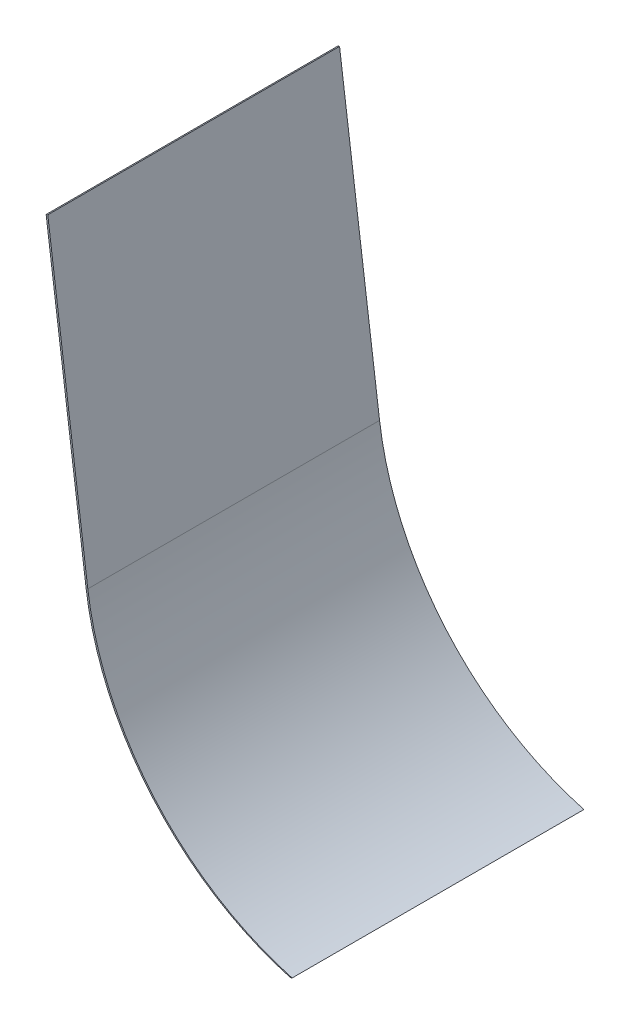
ISO-10303-21;
HEADER;
FILE_DESCRIPTION(('STEP AP214'),'2;1');
FILE_NAME('part.step','',(''),(''),'','','');
FILE_SCHEMA(('AUTOMOTIVE_DESIGN { 1 0 10303 214 1 1 1 1 }'));
ENDSEC;
DATA;
#1=APPLICATION_CONTEXT('core data for automotive mechanical design processes');
#2=APPLICATION_PROTOCOL_DEFINITION('international standard','automotive_design',2000,#1);
#3=PRODUCT_CONTEXT('',#1,'mechanical');
#4=PRODUCT('Part','Part','',(#3));
#5=PRODUCT_RELATED_PRODUCT_CATEGORY('part','',(#4));
#6=PRODUCT_DEFINITION_FORMATION('','',#4);
#7=PRODUCT_DEFINITION_CONTEXT('part definition',#1,'design');
#8=PRODUCT_DEFINITION('design','',#6,#7);
#9=PRODUCT_DEFINITION_SHAPE('','',#8);
#10=(LENGTH_UNIT() NAMED_UNIT(*) SI_UNIT(.MILLI.,.METRE.));
#11=(NAMED_UNIT(*) PLANE_ANGLE_UNIT() SI_UNIT($,.RADIAN.));
#12=(NAMED_UNIT(*) SI_UNIT($,.STERADIAN.) SOLID_ANGLE_UNIT());
#13=UNCERTAINTY_MEASURE_WITH_UNIT(LENGTH_MEASURE(1.E-05),#10,'distance_accuracy_value','');
#14=(GEOMETRIC_REPRESENTATION_CONTEXT(3) GLOBAL_UNCERTAINTY_ASSIGNED_CONTEXT((#13)) GLOBAL_UNIT_ASSIGNED_CONTEXT((#10,
#11,#12)) REPRESENTATION_CONTEXT('',''));
#15=CARTESIAN_POINT('',(0.,0.,0.));
#16=DIRECTION('',(0.,0.,1.));
#17=DIRECTION('',(1.,0.,0.));
#18=AXIS2_PLACEMENT_3D('',#15,#16,#17);
#19=CARTESIAN_POINT('',(-22.2558385353697,1100.13470649072,536.448));
#20=DIRECTION('',(0.298124189718695,-0.954527091027055,0.));
#21=DIRECTION('',(0.954527091027055,0.298124189718695,0.));
#22=AXIS2_PLACEMENT_3D('',#19,#20,#21);
#23=PLANE('',#22);
#24=DIRECTION('',(-0.954527091027055,-0.298124189718695,0.));
#25=VECTOR('',#24,1.);
#26=CARTESIAN_POINT('',(-22.2558385353697,1100.13470649072,0.));
#27=LINE('',#26,#25);
#28=CARTESIAN_POINT('',(-19.2252150213588,1101.08125079308,0.));
#29=VERTEX_POINT('',#28);
#30=CARTESIAN_POINT('',(-22.2558385353697,1100.13470649072,0.));
#31=VERTEX_POINT('',#30);
#32=EDGE_CURVE('E138',#29,#31,#27,.T.);
#33=ORIENTED_EDGE('',*,*,#32,.T.);
#34=DIRECTION('',(0.,0.,-1.));
#35=VECTOR('',#34,1.);
#36=CARTESIAN_POINT('',(-22.2558385353697,1100.13470649072,536.448));
#37=LINE('',#36,#35);
#38=CARTESIAN_POINT('',(-22.2558385353697,1100.13470649072,536.448));
#39=VERTEX_POINT('',#38);
#40=EDGE_CURVE('E11',#39,#31,#37,.T.);
#41=ORIENTED_EDGE('',*,*,#40,.F.);
#42=DIRECTION('',(-0.954527091027055,-0.298124189718695,0.));
#43=VECTOR('',#42,1.);
#44=CARTESIAN_POINT('',(-22.2558385353697,1100.13470649072,536.448));
#45=LINE('',#44,#43);
#46=CARTESIAN_POINT('',(-19.2252150213588,1101.08125079308,536.448));
#47=VERTEX_POINT('',#46);
#48=EDGE_CURVE('E154',#47,#39,#45,.T.);
#49=ORIENTED_EDGE('',*,*,#48,.F.);
#50=DIRECTION('',(0.,0.,-1.));
#51=VECTOR('',#50,1.);
#52=CARTESIAN_POINT('',(-19.2252150213588,1101.08125079308,536.448));
#53=LINE('',#52,#51);
#54=EDGE_CURVE('E134',#47,#29,#53,.T.);
#55=ORIENTED_EDGE('',*,*,#54,.T.);
#56=EDGE_LOOP('',(#33,#41,#49,#55));
#57=FACE_BOUND('',#56,.T.);
#58=ADVANCED_FACE('F43',(#57),#23,.F.);
#59=CARTESIAN_POINT('',(-22.2558385353697,1100.13470649072,536.448));
#60=DIRECTION('',(0.991444861373811,0.130526192220048,0.));
#61=DIRECTION('',(-0.130526192220048,0.991444861373811,0.));
#62=AXIS2_PLACEMENT_3D('',#59,#60,#61);
#63=PLANE('',#62);
#64=DIRECTION('',(0.130526192220048,-0.991444861373811,0.));
#65=VECTOR('',#64,1.);
#66=CARTESIAN_POINT('',(-22.2558385353697,1100.13470649072,0.));
#67=LINE('',#66,#65);
#68=CARTESIAN_POINT('',(51.3115771164653,541.334706490722,0.));
#69=VERTEX_POINT('',#68);
#70=EDGE_CURVE('E142',#31,#69,#67,.T.);
#71=ORIENTED_EDGE('',*,*,#70,.T.);
#72=DIRECTION('',(0.,0.,-1.));
#73=VECTOR('',#72,1.);
#74=CARTESIAN_POINT('',(51.3115771164653,541.334706490722,536.448));
#75=LINE('',#74,#73);
#76=CARTESIAN_POINT('',(51.3115771164653,541.334706490722,536.448));
#77=VERTEX_POINT('',#76);
#78=EDGE_CURVE('E52',#77,#69,#75,.T.);
#79=ORIENTED_EDGE('',*,*,#78,.F.);
#80=DIRECTION('',(0.130526192220048,-0.991444861373811,0.));
#81=VECTOR('',#80,1.);
#82=CARTESIAN_POINT('',(-22.2558385353697,1100.13470649072,536.448));
#83=LINE('',#82,#81);
#84=EDGE_CURVE('E100',#39,#77,#83,.T.);
#85=ORIENTED_EDGE('',*,*,#84,.F.);
#86=ORIENTED_EDGE('',*,*,#40,.T.);
#87=EDGE_LOOP('',(#71,#79,#85,#86));
#88=FACE_BOUND('',#87,.T.);
#89=ADVANCED_FACE('F182',(#88),#63,.F.);
#90=CARTESIAN_POINT('',(565.061154076165,608.971121431932,536.448));
#91=DIRECTION('',(0.,0.,-1.));
#92=DIRECTION('',(-1.,0.,0.));
#93=AXIS2_PLACEMENT_3D('',#90,#91,#92);
#94=CYLINDRICAL_SURFACE('',#93,518.182701807354);
#95=CARTESIAN_POINT('',(565.061154076165,608.971121431932,0.));
#96=DIRECTION('',(0.,0.,1.));
#97=DIRECTION('',(1.,0.,0.));
#98=AXIS2_PLACEMENT_3D('',#95,#96,#97);
#99=CIRCLE('',#98,518.182701807354);
#100=CARTESIAN_POINT('',(426.94316146463,109.534706490722,0.));
#101=VERTEX_POINT('',#100);
#102=EDGE_CURVE('E145',#69,#101,#99,.T.);
#103=ORIENTED_EDGE('',*,*,#102,.T.);
#104=DIRECTION('',(0.,0.,-1.));
#105=VECTOR('',#104,1.);
#106=CARTESIAN_POINT('',(426.94316146463,109.534706490722,536.448));
#107=LINE('',#106,#105);
#108=CARTESIAN_POINT('',(426.94316146463,109.534706490722,536.448));
#109=VERTEX_POINT('',#108);
#110=EDGE_CURVE('E127',#109,#101,#107,.T.);
#111=ORIENTED_EDGE('',*,*,#110,.F.);
#112=CARTESIAN_POINT('',(565.061154076165,608.971121431932,536.448));
#113=DIRECTION('',(0.,0.,1.));
#114=DIRECTION('',(1.,0.,0.));
#115=AXIS2_PLACEMENT_3D('',#112,#113,#114);
#116=CIRCLE('',#115,518.182701807354);
#117=EDGE_CURVE('E116',#77,#109,#116,.T.);
#118=ORIENTED_EDGE('',*,*,#117,.F.);
#119=ORIENTED_EDGE('',*,*,#78,.T.);
#120=EDGE_LOOP('',(#103,#111,#118,#119));
#121=FACE_BOUND('',#120,.T.);
#122=ADVANCED_FACE('F164',(#121),#94,.T.);
#123=CARTESIAN_POINT('',(426.94316146463,109.534706490722,536.448));
#124=DIRECTION('',(-0.298124189718695,0.954527091027055,0.));
#125=DIRECTION('',(-0.954527091027055,-0.298124189718695,0.));
#126=AXIS2_PLACEMENT_3D('',#123,#124,#125);
#127=PLANE('',#126);
#128=DIRECTION('',(0.954527091027055,0.298124189718695,0.));
#129=VECTOR('',#128,1.);
#130=CARTESIAN_POINT('',(426.94316146463,109.534706490722,0.));
#131=LINE('',#130,#129);
#132=CARTESIAN_POINT('',(429.973784978641,110.481250793079,0.));
#133=VERTEX_POINT('',#132);
#134=EDGE_CURVE('E125',#101,#133,#131,.T.);
#135=ORIENTED_EDGE('',*,*,#134,.T.);
#136=DIRECTION('',(0.,0.,-1.));
#137=VECTOR('',#136,1.);
#138=CARTESIAN_POINT('',(429.973784978641,110.481250793079,536.448));
#139=LINE('',#138,#137);
#140=CARTESIAN_POINT('',(429.973784978641,110.481250793079,536.448));
#141=VERTEX_POINT('',#140);
#142=EDGE_CURVE('E122',#141,#133,#139,.T.);
#143=ORIENTED_EDGE('',*,*,#142,.F.);
#144=DIRECTION('',(0.954527091027055,0.298124189718695,0.));
#145=VECTOR('',#144,1.);
#146=CARTESIAN_POINT('',(426.94316146463,109.534706490722,536.448));
#147=LINE('',#146,#145);
#148=EDGE_CURVE('E110',#109,#141,#147,.T.);
#149=ORIENTED_EDGE('',*,*,#148,.F.);
#150=ORIENTED_EDGE('',*,*,#110,.T.);
#151=EDGE_LOOP('',(#135,#143,#149,#150));
#152=FACE_BOUND('',#151,.T.);
#153=ADVANCED_FACE('F123',(#152),#127,.F.);
#154=CARTESIAN_POINT('',(568.091777590175,609.91766573429,536.448));
#155=DIRECTION('',(0.,0.,-1.));
#156=DIRECTION('',(-1.,0.,0.));
#157=AXIS2_PLACEMENT_3D('',#154,#155,#156);
#158=CYLINDRICAL_SURFACE('',#157,518.182701807354);
#159=CARTESIAN_POINT('',(568.091777590175,609.91766573429,0.));
#160=DIRECTION('',(0.,0.,-1.));
#161=DIRECTION('',(1.,0.,0.));
#162=AXIS2_PLACEMENT_3D('',#159,#160,#161);
#163=CIRCLE('',#162,518.182701807354);
#164=CARTESIAN_POINT('',(54.342200630476,542.281250793079,0.));
#165=VERTEX_POINT('',#164);
#166=EDGE_CURVE('E86',#133,#165,#163,.T.);
#167=ORIENTED_EDGE('',*,*,#166,.T.);
#168=DIRECTION('',(0.,0.,-1.));
#169=VECTOR('',#168,1.);
#170=CARTESIAN_POINT('',(54.342200630476,542.281250793079,536.448));
#171=LINE('',#170,#169);
#172=CARTESIAN_POINT('',(54.342200630476,542.281250793079,536.448));
#173=VERTEX_POINT('',#172);
#174=EDGE_CURVE('E128',#173,#165,#171,.T.);
#175=ORIENTED_EDGE('',*,*,#174,.F.);
#176=CARTESIAN_POINT('',(568.091777590175,609.91766573429,536.448));
#177=DIRECTION('',(0.,0.,-1.));
#178=DIRECTION('',(1.,0.,0.));
#179=AXIS2_PLACEMENT_3D('',#176,#177,#178);
#180=CIRCLE('',#179,518.182701807354);
#181=EDGE_CURVE('E114',#141,#173,#180,.T.);
#182=ORIENTED_EDGE('',*,*,#181,.F.);
#183=ORIENTED_EDGE('',*,*,#142,.T.);
#184=EDGE_LOOP('',(#167,#175,#182,#183));
#185=FACE_BOUND('',#184,.T.);
#186=ADVANCED_FACE('F130',(#185),#158,.F.);
#187=CARTESIAN_POINT('',(-19.2252150213588,1101.08125079308,536.448));
#188=DIRECTION('',(-0.991444861373811,-0.130526192220048,0.));
#189=DIRECTION('',(0.130526192220048,-0.991444861373811,0.));
#190=AXIS2_PLACEMENT_3D('',#187,#188,#189);
#191=PLANE('',#190);
#192=DIRECTION('',(-0.130526192220048,0.991444861373811,0.));
#193=VECTOR('',#192,1.);
#194=CARTESIAN_POINT('',(-19.2252150213588,1101.08125079308,0.));
#195=LINE('',#194,#193);
#196=EDGE_CURVE('E92',#165,#29,#195,.T.);
#197=ORIENTED_EDGE('',*,*,#196,.T.);
#198=ORIENTED_EDGE('',*,*,#54,.F.);
#199=DIRECTION('',(-0.130526192220048,0.991444861373811,0.));
#200=VECTOR('',#199,1.);
#201=CARTESIAN_POINT('',(-19.2252150213588,1101.08125079308,536.448));
#202=LINE('',#201,#200);
#203=EDGE_CURVE('E60',#173,#47,#202,.T.);
#204=ORIENTED_EDGE('',*,*,#203,.F.);
#205=ORIENTED_EDGE('',*,*,#174,.T.);
#206=EDGE_LOOP('',(#197,#198,#204,#205));
#207=FACE_BOUND('',#206,.T.);
#208=ADVANCED_FACE('F171',(#207),#191,.F.);
#209=CARTESIAN_POINT('',(568.091777590175,609.91766573429,536.448));
#210=DIRECTION('',(0.,0.,1.));
#211=DIRECTION('',(1.,0.,0.));
#212=AXIS2_PLACEMENT_3D('',#209,#210,#211);
#213=PLANE('',#212);
#214=ORIENTED_EDGE('',*,*,#48,.T.);
#215=ORIENTED_EDGE('',*,*,#84,.T.);
#216=ORIENTED_EDGE('',*,*,#117,.T.);
#217=ORIENTED_EDGE('',*,*,#148,.T.);
#218=ORIENTED_EDGE('',*,*,#181,.T.);
#219=ORIENTED_EDGE('',*,*,#203,.T.);
#220=EDGE_LOOP('',(#214,#215,#216,#217,#218,#219));
#221=FACE_BOUND('',#220,.T.);
#222=ADVANCED_FACE('F112',(#221),#213,.T.);
#223=CARTESIAN_POINT('',(568.091777590175,609.91766573429,0.));
#224=DIRECTION('',(0.,0.,1.));
#225=DIRECTION('',(1.,0.,0.));
#226=AXIS2_PLACEMENT_3D('',#223,#224,#225);
#227=PLANE('',#226);
#228=ORIENTED_EDGE('',*,*,#32,.F.);
#229=ORIENTED_EDGE('',*,*,#196,.F.);
#230=ORIENTED_EDGE('',*,*,#166,.F.);
#231=ORIENTED_EDGE('',*,*,#134,.F.);
#232=ORIENTED_EDGE('',*,*,#102,.F.);
#233=ORIENTED_EDGE('',*,*,#70,.F.);
#234=EDGE_LOOP('',(#228,#229,#230,#231,#232,#233));
#235=FACE_BOUND('',#234,.T.);
#236=ADVANCED_FACE('F167',(#235),#227,.F.);
#237=CLOSED_SHELL('',(#58,#89,#122,#153,#186,#208,#222,#236));
#238=MANIFOLD_SOLID_BREP('B2',#237);
#239=ADVANCED_BREP_SHAPE_REPRESENTATION('',(#18,#238),#14);
#240=SHAPE_DEFINITION_REPRESENTATION(#9,#239);
ENDSEC;
END-ISO-10303-21;
